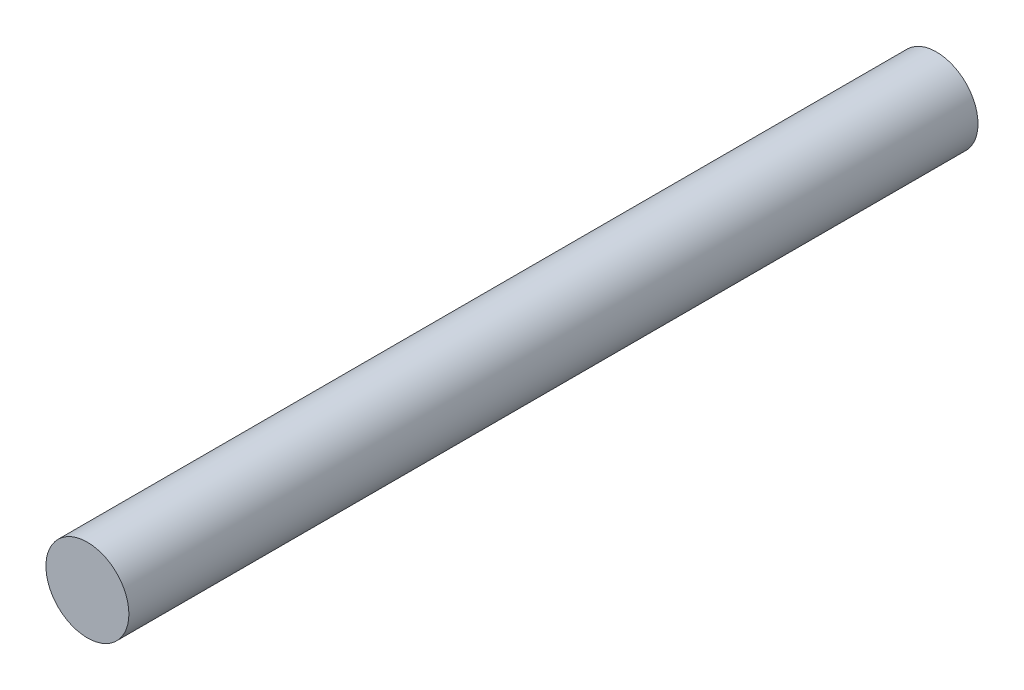
ISO-10303-21;
HEADER;
FILE_DESCRIPTION(('STEP AP214'),'2;1');
FILE_NAME('part.step','',(''),(''),'','','');
FILE_SCHEMA(('AUTOMOTIVE_DESIGN { 1 0 10303 214 1 1 1 1 }'));
ENDSEC;
DATA;
#1=APPLICATION_CONTEXT('core data for automotive mechanical design processes');
#2=APPLICATION_PROTOCOL_DEFINITION('international standard','automotive_design',2000,#1);
#3=PRODUCT_CONTEXT('',#1,'mechanical');
#4=PRODUCT('Part','Part','',(#3));
#5=PRODUCT_RELATED_PRODUCT_CATEGORY('part','',(#4));
#6=PRODUCT_DEFINITION_FORMATION('','',#4);
#7=PRODUCT_DEFINITION_CONTEXT('part definition',#1,'design');
#8=PRODUCT_DEFINITION('design','',#6,#7);
#9=PRODUCT_DEFINITION_SHAPE('','',#8);
#10=(LENGTH_UNIT() NAMED_UNIT(*) SI_UNIT(.MILLI.,.METRE.));
#11=(NAMED_UNIT(*) PLANE_ANGLE_UNIT() SI_UNIT($,.RADIAN.));
#12=(NAMED_UNIT(*) SI_UNIT($,.STERADIAN.) SOLID_ANGLE_UNIT());
#13=UNCERTAINTY_MEASURE_WITH_UNIT(LENGTH_MEASURE(1.E-05),#10,'distance_accuracy_value','');
#14=(GEOMETRIC_REPRESENTATION_CONTEXT(3) GLOBAL_UNCERTAINTY_ASSIGNED_CONTEXT((#13)) GLOBAL_UNIT_ASSIGNED_CONTEXT((#10,
#11,#12)) REPRESENTATION_CONTEXT('',''));
#15=CARTESIAN_POINT('',(0.,0.,0.));
#16=DIRECTION('',(0.,0.,1.));
#17=DIRECTION('',(1.,0.,0.));
#18=AXIS2_PLACEMENT_3D('',#15,#16,#17);
#19=CARTESIAN_POINT('',(-67.890147021778,12.1392978118411,130.));
#20=DIRECTION('',(0.,0.,-1.));
#21=DIRECTION('',(-1.,0.,0.));
#22=AXIS2_PLACEMENT_3D('',#19,#20,#21);
#23=CYLINDRICAL_SURFACE('',#22,6.35);
#24=CARTESIAN_POINT('',(-67.890147021778,12.1392978118411,130.));
#25=DIRECTION('',(0.,0.,1.));
#26=DIRECTION('',(1.,0.,0.));
#27=AXIS2_PLACEMENT_3D('',#24,#25,#26);
#28=CIRCLE('',#27,6.35);
#29=CARTESIAN_POINT('',(-61.540147021778,12.1392978118411,130.));
#30=VERTEX_POINT('',#29);
#31=EDGE_CURVE('E10',#30,#30,#28,.T.);
#32=ORIENTED_EDGE('',*,*,#31,.F.);
#33=EDGE_LOOP('',(#32));
#34=FACE_BOUND('',#33,.T.);
#35=CARTESIAN_POINT('',(-67.890147021778,12.1392978118411,0.));
#36=DIRECTION('',(0.,0.,1.));
#37=DIRECTION('',(1.,0.,0.));
#38=AXIS2_PLACEMENT_3D('',#35,#36,#37);
#39=CIRCLE('',#38,6.35);
#40=CARTESIAN_POINT('',(-61.540147021778,12.1392978118411,0.));
#41=VERTEX_POINT('',#40);
#42=EDGE_CURVE('E48',#41,#41,#39,.T.);
#43=ORIENTED_EDGE('',*,*,#42,.T.);
#44=EDGE_LOOP('',(#43));
#45=FACE_BOUND('',#44,.T.);
#46=ADVANCED_FACE('F45',(#34,#45),#23,.T.);
#47=CARTESIAN_POINT('',(-67.890147021778,12.1392978118411,130.));
#48=DIRECTION('',(0.,0.,1.));
#49=DIRECTION('',(1.,0.,0.));
#50=AXIS2_PLACEMENT_3D('',#47,#48,#49);
#51=PLANE('',#50);
#52=ORIENTED_EDGE('',*,*,#31,.T.);
#53=EDGE_LOOP('',(#52));
#54=FACE_BOUND('',#53,.T.);
#55=ADVANCED_FACE('F62',(#54),#51,.T.);
#56=CARTESIAN_POINT('',(-67.890147021778,12.1392978118411,0.));
#57=DIRECTION('',(0.,0.,1.));
#58=DIRECTION('',(1.,0.,0.));
#59=AXIS2_PLACEMENT_3D('',#56,#57,#58);
#60=PLANE('',#59);
#61=ORIENTED_EDGE('',*,*,#42,.F.);
#62=EDGE_LOOP('',(#61));
#63=FACE_BOUND('',#62,.T.);
#64=ADVANCED_FACE('F60',(#63),#60,.F.);
#65=CLOSED_SHELL('',(#46,#55,#64));
#66=MANIFOLD_SOLID_BREP('B2',#65);
#67=ADVANCED_BREP_SHAPE_REPRESENTATION('',(#18,#66),#14);
#68=SHAPE_DEFINITION_REPRESENTATION(#9,#67);
ENDSEC;
END-ISO-10303-21;
